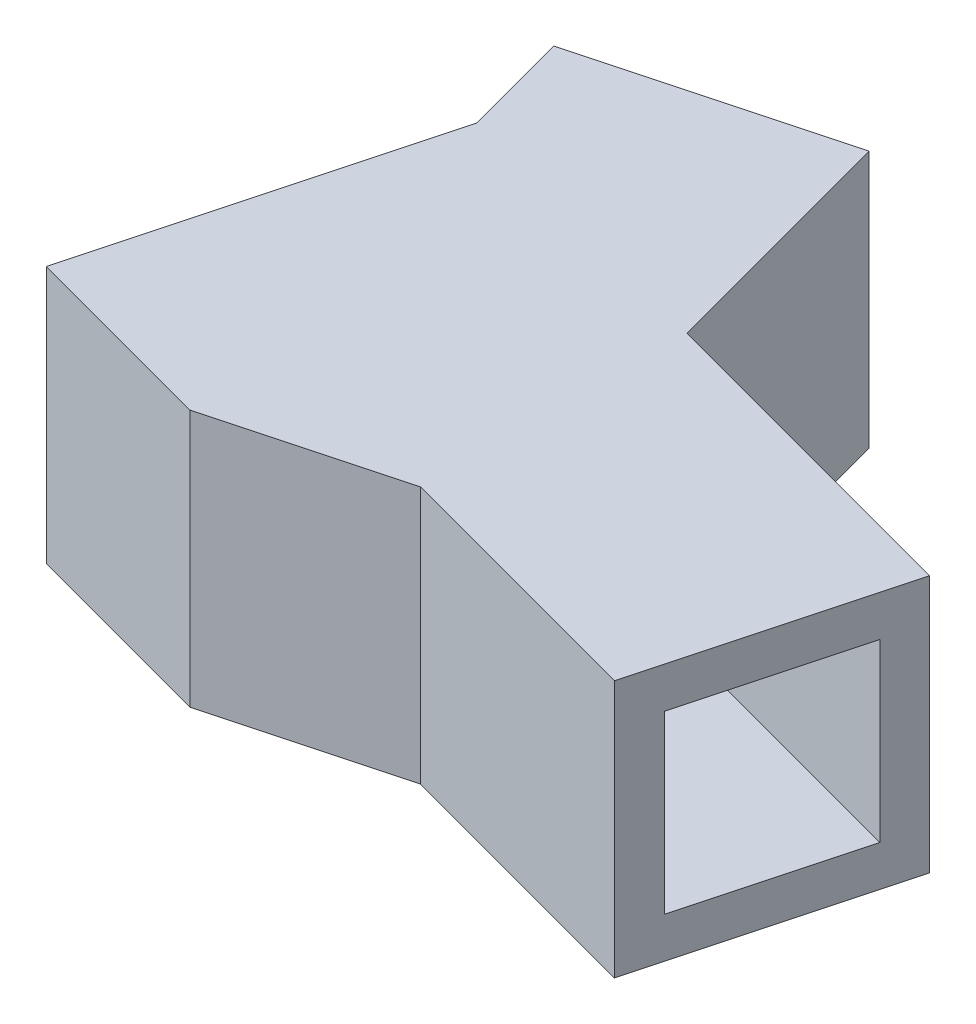
ISO-10303-21;
HEADER;
FILE_DESCRIPTION(('STEP AP214'),'2;1');
FILE_NAME('part.step','',(''),(''),'','','');
FILE_SCHEMA(('AUTOMOTIVE_DESIGN { 1 0 10303 214 1 1 1 1 }'));
ENDSEC;
DATA;
#1=APPLICATION_CONTEXT('core data for automotive mechanical design processes');
#2=APPLICATION_PROTOCOL_DEFINITION('international standard','automotive_design',2000,#1);
#3=PRODUCT_CONTEXT('',#1,'mechanical');
#4=PRODUCT('Part','Part','',(#3));
#5=PRODUCT_RELATED_PRODUCT_CATEGORY('part','',(#4));
#6=PRODUCT_DEFINITION_FORMATION('','',#4);
#7=PRODUCT_DEFINITION_CONTEXT('part definition',#1,'design');
#8=PRODUCT_DEFINITION('design','',#6,#7);
#9=PRODUCT_DEFINITION_SHAPE('','',#8);
#10=(LENGTH_UNIT() NAMED_UNIT(*) SI_UNIT(.MILLI.,.METRE.));
#11=(NAMED_UNIT(*) PLANE_ANGLE_UNIT() SI_UNIT($,.RADIAN.));
#12=(NAMED_UNIT(*) SI_UNIT($,.STERADIAN.) SOLID_ANGLE_UNIT());
#13=UNCERTAINTY_MEASURE_WITH_UNIT(LENGTH_MEASURE(1.E-05),#10,'distance_accuracy_value','');
#14=(GEOMETRIC_REPRESENTATION_CONTEXT(3) GLOBAL_UNCERTAINTY_ASSIGNED_CONTEXT((#13)) GLOBAL_UNIT_ASSIGNED_CONTEXT((#10,
#11,#12)) REPRESENTATION_CONTEXT('',''));
#15=CARTESIAN_POINT('',(0.,0.,0.));
#16=DIRECTION('',(0.,0.,1.));
#17=DIRECTION('',(1.,0.,0.));
#18=AXIS2_PLACEMENT_3D('',#15,#16,#17);
#19=CARTESIAN_POINT('',(-3.88228567653782,15.,-30.0180301004873));
#20=DIRECTION('',(0.258819045102521,0.,0.965925826289068));
#21=DIRECTION('',(0.965925826289068,0.,-0.258819045102521));
#22=AXIS2_PLACEMENT_3D('',#19,#20,#21);
#23=PLANE('',#22);
#24=DIRECTION('',(0.965925826289068,0.,-0.258819045102521));
#25=VECTOR('',#24,1.);
#26=CARTESIAN_POINT('',(-6.17635951397435,12.625,-29.4033348683688));
#27=LINE('',#26,#25);
#28=CARTESIAN_POINT('',(-16.0770992334373,12.625,-26.7504396560679));
#29=VERTEX_POINT('',#28);
#30=CARTESIAN_POINT('',(-6.17635951397435,12.625,-29.4033348683688));
#31=VERTEX_POINT('',#30);
#32=EDGE_CURVE('E301',#29,#31,#27,.T.);
#33=ORIENTED_EDGE('',*,*,#32,.F.);
#34=DIRECTION('',(0.,1.,0.));
#35=VECTOR('',#34,1.);
#36=CARTESIAN_POINT('',(-16.0770992334373,12.625,-26.7504396560679));
#37=LINE('',#36,#35);
#38=CARTESIAN_POINT('',(-16.0770992334373,2.375,-26.7504396560679));
#39=VERTEX_POINT('',#38);
#40=EDGE_CURVE('E279',#39,#29,#37,.T.);
#41=ORIENTED_EDGE('',*,*,#40,.F.);
#42=DIRECTION('',(-0.965925826289068,0.,0.258819045102521));
#43=VECTOR('',#42,1.);
#44=CARTESIAN_POINT('',(-6.17635951397436,2.375,-29.4033348683688));
#45=LINE('',#44,#43);
#46=CARTESIAN_POINT('',(-6.17635951397436,2.375,-29.4033348683688));
#47=VERTEX_POINT('',#46);
#48=EDGE_CURVE('E307',#47,#39,#45,.T.);
#49=ORIENTED_EDGE('',*,*,#48,.F.);
#50=DIRECTION('',(0.,-1.,0.));
#51=VECTOR('',#50,1.);
#52=CARTESIAN_POINT('',(-6.17635951397435,12.625,-29.4033348683688));
#53=LINE('',#52,#51);
#54=EDGE_CURVE('E304',#31,#47,#53,.T.);
#55=ORIENTED_EDGE('',*,*,#54,.F.);
#56=EDGE_LOOP('',(#33,#41,#49,#55));
#57=FACE_BOUND('',#56,.T.);
#58=DIRECTION('',(-0.965925826289068,0.,0.258819045102521));
#59=VECTOR('',#58,1.);
#60=CARTESIAN_POINT('',(-3.88228567653782,0.,-30.0180301004873));
#61=LINE('',#60,#59);
#62=CARTESIAN_POINT('',(-3.88228567653782,0.,-30.0180301004873));
#63=VERTEX_POINT('',#62);
#64=CARTESIAN_POINT('',(-18.3711730708738,0.,-26.1357444239495));
#65=VERTEX_POINT('',#64);
#66=EDGE_CURVE('E344',#63,#65,#61,.T.);
#67=ORIENTED_EDGE('',*,*,#66,.T.);
#68=DIRECTION('',(0.,-1.,0.));
#69=VECTOR('',#68,1.);
#70=CARTESIAN_POINT('',(-18.3711730708738,15.,-26.1357444239495));
#71=LINE('',#70,#69);
#72=CARTESIAN_POINT('',(-18.3711730708738,15.,-26.1357444239495));
#73=VERTEX_POINT('',#72);
#74=EDGE_CURVE('E395',#73,#65,#71,.T.);
#75=ORIENTED_EDGE('',*,*,#74,.F.);
#76=DIRECTION('',(-0.965925826289068,0.,0.258819045102521));
#77=VECTOR('',#76,1.);
#78=CARTESIAN_POINT('',(-3.88228567653782,15.,-30.0180301004873));
#79=LINE('',#78,#77);
#80=CARTESIAN_POINT('',(-3.88228567653782,15.,-30.0180301004873));
#81=VERTEX_POINT('',#80);
#82=EDGE_CURVE('E351',#81,#73,#79,.T.);
#83=ORIENTED_EDGE('',*,*,#82,.F.);
#84=DIRECTION('',(0.,-1.,0.));
#85=VECTOR('',#84,1.);
#86=CARTESIAN_POINT('',(-3.88228567653782,15.,-30.0180301004873));
#87=LINE('',#86,#85);
#88=EDGE_CURVE('E365',#81,#63,#87,.T.);
#89=ORIENTED_EDGE('',*,*,#88,.T.);
#90=EDGE_LOOP('',(#67,#75,#83,#89));
#91=FACE_BOUND('',#90,.T.);
#92=ADVANCED_FACE('F37',(#57,#91),#23,.F.);
#93=CARTESIAN_POINT('',(-18.3711730708738,15.,-26.1357444239495));
#94=DIRECTION('',(0.965925826289068,0.,-0.258819045102522));
#95=DIRECTION('',(-0.258819045102522,0.,-0.965925826289068));
#96=AXIS2_PLACEMENT_3D('',#93,#94,#95);
#97=PLANE('',#96);
#98=DIRECTION('',(0.258819045102522,0.,0.965925826289068));
#99=VECTOR('',#98,1.);
#100=CARTESIAN_POINT('',(-18.3711730708738,0.,-26.1357444239495));
#101=LINE('',#100,#99);
#102=CARTESIAN_POINT('',(-16.7303260747562,0.,-20.0120200669915));
#103=VERTEX_POINT('',#102);
#104=EDGE_CURVE('E368',#65,#103,#101,.T.);
#105=ORIENTED_EDGE('',*,*,#104,.T.);
#106=DIRECTION('',(0.,1.,0.));
#107=VECTOR('',#106,1.);
#108=CARTESIAN_POINT('',(-16.7303260747562,-25.5516051632606,-20.0120200669915));
#109=LINE('',#108,#107);
#110=CARTESIAN_POINT('',(-16.7303260747562,15.,-20.0120200669915));
#111=VERTEX_POINT('',#110);
#112=EDGE_CURVE('E242',#103,#111,#109,.T.);
#113=ORIENTED_EDGE('',*,*,#112,.T.);
#114=DIRECTION('',(0.258819045102522,0.,0.965925826289068));
#115=VECTOR('',#114,1.);
#116=CARTESIAN_POINT('',(-18.3711730708738,15.,-26.1357444239495));
#117=LINE('',#116,#115);
#118=EDGE_CURVE('E251',#73,#111,#117,.T.);
#119=ORIENTED_EDGE('',*,*,#118,.F.);
#120=ORIENTED_EDGE('',*,*,#74,.T.);
#121=EDGE_LOOP('',(#105,#113,#119,#120));
#122=FACE_BOUND('',#121,.T.);
#123=ADVANCED_FACE('F536',(#122),#97,.F.);
#124=CARTESIAN_POINT('',(-10.6066017177982,15.,2.84203036472259));
#125=DIRECTION('',(-0.258819045102521,0.,-0.965925826289068));
#126=DIRECTION('',(-0.965925826289068,0.,0.258819045102521));
#127=AXIS2_PLACEMENT_3D('',#124,#125,#126);
#128=PLANE('',#127);
#129=DIRECTION('',(0.965925826289068,0.,-0.258819045102521));
#130=VECTOR('',#129,1.);
#131=CARTESIAN_POINT('',(-10.6066017177982,0.,2.84203036472259));
#132=LINE('',#131,#130);
#133=CARTESIAN_POINT('',(-10.6066017177982,0.,2.84203036472259));
#134=VERTEX_POINT('',#133);
#135=CARTESIAN_POINT('',(0.,0.,0.));
#136=VERTEX_POINT('',#135);
#137=EDGE_CURVE('E371',#134,#136,#132,.T.);
#138=ORIENTED_EDGE('',*,*,#137,.T.);
#139=DIRECTION('',(0.,-1.,0.));
#140=VECTOR('',#139,1.);
#141=CARTESIAN_POINT('',(0.,15.,0.));
#142=LINE('',#141,#140);
#143=CARTESIAN_POINT('',(0.,15.,0.));
#144=VERTEX_POINT('',#143);
#145=EDGE_CURVE('E391',#144,#136,#142,.T.);
#146=ORIENTED_EDGE('',*,*,#145,.F.);
#147=DIRECTION('',(0.965925826289068,0.,-0.258819045102521));
#148=VECTOR('',#147,1.);
#149=CARTESIAN_POINT('',(-10.6066017177982,15.,2.84203036472259));
#150=LINE('',#149,#148);
#151=CARTESIAN_POINT('',(-10.6066017177982,15.,2.84203036472259));
#152=VERTEX_POINT('',#151);
#153=EDGE_CURVE('E355',#152,#144,#150,.T.);
#154=ORIENTED_EDGE('',*,*,#153,.F.);
#155=DIRECTION('',(0.,-1.,0.));
#156=VECTOR('',#155,1.);
#157=CARTESIAN_POINT('',(-10.6066017177982,15.,2.84203036472259));
#158=LINE('',#157,#156);
#159=EDGE_CURVE('E255',#152,#134,#158,.T.);
#160=ORIENTED_EDGE('',*,*,#159,.T.);
#161=EDGE_LOOP('',(#138,#146,#154,#160));
#162=FACE_BOUND('',#161,.T.);
#163=ADVANCED_FACE('F543',(#162),#128,.F.);
#164=CARTESIAN_POINT('',(0.,15.,0.));
#165=DIRECTION('',(0.258819045102521,0.,-0.965925826289068));
#166=DIRECTION('',(-0.965925826289068,0.,-0.258819045102521));
#167=AXIS2_PLACEMENT_3D('',#164,#165,#166);
#168=PLANE('',#167);
#169=DIRECTION('',(0.965925826289068,0.,0.258819045102521));
#170=VECTOR('',#169,1.);
#171=CARTESIAN_POINT('',(0.,0.,0.));
#172=LINE('',#171,#170);
#173=CARTESIAN_POINT('',(15.4362308492435,0.,4.1361255902352));
#174=VERTEX_POINT('',#173);
#175=EDGE_CURVE('E373',#136,#174,#172,.T.);
#176=ORIENTED_EDGE('',*,*,#175,.T.);
#177=DIRECTION('',(0.,-1.,0.));
#178=VECTOR('',#177,1.);
#179=CARTESIAN_POINT('',(15.4362308492435,15.,4.1361255902352));
#180=LINE('',#179,#178);
#181=CARTESIAN_POINT('',(15.4362308492435,15.,4.1361255902352));
#182=VERTEX_POINT('',#181);
#183=EDGE_CURVE('E388',#182,#174,#180,.T.);
#184=ORIENTED_EDGE('',*,*,#183,.F.);
#185=DIRECTION('',(0.965925826289068,0.,0.258819045102521));
#186=VECTOR('',#185,1.);
#187=CARTESIAN_POINT('',(0.,15.,0.));
#188=LINE('',#187,#186);
#189=EDGE_CURVE('E357',#144,#182,#188,.T.);
#190=ORIENTED_EDGE('',*,*,#189,.F.);
#191=ORIENTED_EDGE('',*,*,#145,.T.);
#192=EDGE_LOOP('',(#176,#184,#190,#191));
#193=FACE_BOUND('',#192,.T.);
#194=ADVANCED_FACE('F612',(#193),#168,.F.);
#195=CARTESIAN_POINT('',(15.4362308492435,15.,4.1361255902352));
#196=DIRECTION('',(-0.965925826289068,0.,-0.258819045102521));
#197=DIRECTION('',(-0.258819045102521,0.,0.965925826289068));
#198=AXIS2_PLACEMENT_3D('',#195,#196,#197);
#199=PLANE('',#198);
#200=DIRECTION('',(-0.258819045102522,0.,0.965925826289068));
#201=VECTOR('',#200,1.);
#202=CARTESIAN_POINT('',(16.050926081362,12.625,1.84205175279867));
#203=LINE('',#202,#201);
#204=CARTESIAN_POINT('',(18.7038212936629,12.625,-8.05868796666426));
#205=VERTEX_POINT('',#204);
#206=CARTESIAN_POINT('',(16.050926081362,12.625,1.84205175279867));
#207=VERTEX_POINT('',#206);
#208=EDGE_CURVE('E334',#205,#207,#203,.T.);
#209=ORIENTED_EDGE('',*,*,#208,.F.);
#210=DIRECTION('',(0.,1.,0.));
#211=VECTOR('',#210,1.);
#212=CARTESIAN_POINT('',(18.7038212936629,2.375,-8.05868796666428));
#213=LINE('',#212,#211);
#214=CARTESIAN_POINT('',(18.7038212936629,2.375,-8.05868796666428));
#215=VERTEX_POINT('',#214);
#216=EDGE_CURVE('E312',#215,#205,#213,.T.);
#217=ORIENTED_EDGE('',*,*,#216,.F.);
#218=DIRECTION('',(0.258819045102522,0.,-0.965925826289068));
#219=VECTOR('',#218,1.);
#220=CARTESIAN_POINT('',(16.050926081362,2.375,1.84205175279867));
#221=LINE('',#220,#219);
#222=CARTESIAN_POINT('',(16.050926081362,2.375,1.84205175279867));
#223=VERTEX_POINT('',#222);
#224=EDGE_CURVE('E323',#223,#215,#221,.T.);
#225=ORIENTED_EDGE('',*,*,#224,.F.);
#226=DIRECTION('',(0.,-1.,0.));
#227=VECTOR('',#226,1.);
#228=CARTESIAN_POINT('',(16.050926081362,2.375,1.84205175279867));
#229=LINE('',#228,#227);
#230=EDGE_CURVE('E337',#207,#223,#229,.T.);
#231=ORIENTED_EDGE('',*,*,#230,.F.);
#232=EDGE_LOOP('',(#209,#217,#225,#231));
#233=FACE_BOUND('',#232,.T.);
#234=DIRECTION('',(0.258819045102521,0.,-0.965925826289068));
#235=VECTOR('',#234,1.);
#236=CARTESIAN_POINT('',(15.4362308492435,0.,4.1361255902352));
#237=LINE('',#236,#235);
#238=CARTESIAN_POINT('',(19.3185165257814,0.,-10.3527618041008));
#239=VERTEX_POINT('',#238);
#240=EDGE_CURVE('E375',#174,#239,#237,.T.);
#241=ORIENTED_EDGE('',*,*,#240,.T.);
#242=DIRECTION('',(0.,-1.,0.));
#243=VECTOR('',#242,1.);
#244=CARTESIAN_POINT('',(19.3185165257814,15.,-10.3527618041008));
#245=LINE('',#244,#243);
#246=CARTESIAN_POINT('',(19.3185165257814,15.,-10.3527618041008));
#247=VERTEX_POINT('',#246);
#248=EDGE_CURVE('E385',#247,#239,#245,.T.);
#249=ORIENTED_EDGE('',*,*,#248,.F.);
#250=DIRECTION('',(0.258819045102521,0.,-0.965925826289068));
#251=VECTOR('',#250,1.);
#252=CARTESIAN_POINT('',(15.4362308492435,15.,4.1361255902352));
#253=LINE('',#252,#251);
#254=EDGE_CURVE('E359',#182,#247,#253,.T.);
#255=ORIENTED_EDGE('',*,*,#254,.F.);
#256=ORIENTED_EDGE('',*,*,#183,.T.);
#257=EDGE_LOOP('',(#241,#249,#255,#256));
#258=FACE_BOUND('',#257,.T.);
#259=ADVANCED_FACE('F807',(#233,#258),#199,.F.);
#260=CARTESIAN_POINT('',(19.3185165257814,15.,-10.3527618041008));
#261=DIRECTION('',(-0.258819045102521,0.,0.965925826289068));
#262=DIRECTION('',(0.965925826289068,0.,0.258819045102521));
#263=AXIS2_PLACEMENT_3D('',#260,#261,#262);
#264=PLANE('',#263);
#265=DIRECTION('',(-0.965925826289068,0.,-0.258819045102522));
#266=VECTOR('',#265,1.);
#267=CARTESIAN_POINT('',(19.3185165257814,0.,-10.3527618041008));
#268=LINE('',#267,#266);
#269=CARTESIAN_POINT('',(0.,0.,-15.5291427061513));
#270=VERTEX_POINT('',#269);
#271=EDGE_CURVE('E377',#239,#270,#268,.T.);
#272=ORIENTED_EDGE('',*,*,#271,.T.);
#273=DIRECTION('',(0.,-1.,0.));
#274=VECTOR('',#273,1.);
#275=CARTESIAN_POINT('',(0.,15.,-15.5291427061513));
#276=LINE('',#275,#274);
#277=CARTESIAN_POINT('',(0.,15.,-15.5291427061513));
#278=VERTEX_POINT('',#277);
#279=EDGE_CURVE('E382',#278,#270,#276,.T.);
#280=ORIENTED_EDGE('',*,*,#279,.F.);
#281=DIRECTION('',(-0.965925826289068,0.,-0.258819045102522));
#282=VECTOR('',#281,1.);
#283=CARTESIAN_POINT('',(19.3185165257814,15.,-10.3527618041008));
#284=LINE('',#283,#282);
#285=EDGE_CURVE('E361',#247,#278,#284,.T.);
#286=ORIENTED_EDGE('',*,*,#285,.F.);
#287=ORIENTED_EDGE('',*,*,#248,.T.);
#288=EDGE_LOOP('',(#272,#280,#286,#287));
#289=FACE_BOUND('',#288,.T.);
#290=ADVANCED_FACE('F812',(#289),#264,.F.);
#291=CARTESIAN_POINT('',(0.,15.,-15.5291427061513));
#292=DIRECTION('',(-0.965925826289068,0.,0.258819045102521));
#293=DIRECTION('',(0.258819045102521,0.,0.965925826289068));
#294=AXIS2_PLACEMENT_3D('',#291,#292,#293);
#295=PLANE('',#294);
#296=DIRECTION('',(-0.258819045102521,0.,-0.965925826289068));
#297=VECTOR('',#296,1.);
#298=CARTESIAN_POINT('',(0.,0.,-15.5291427061513));
#299=LINE('',#298,#297);
#300=EDGE_CURVE('E353',#270,#63,#299,.T.);
#301=ORIENTED_EDGE('',*,*,#300,.T.);
#302=ORIENTED_EDGE('',*,*,#88,.F.);
#303=DIRECTION('',(-0.258819045102521,0.,-0.965925826289068));
#304=VECTOR('',#303,1.);
#305=CARTESIAN_POINT('',(0.,15.,-15.5291427061513));
#306=LINE('',#305,#304);
#307=EDGE_CURVE('E363',#278,#81,#306,.T.);
#308=ORIENTED_EDGE('',*,*,#307,.F.);
#309=ORIENTED_EDGE('',*,*,#279,.T.);
#310=EDGE_LOOP('',(#301,#302,#308,#309));
#311=FACE_BOUND('',#310,.T.);
#312=ADVANCED_FACE('F603',(#311),#295,.F.);
#313=CARTESIAN_POINT('',(0.,15.,0.));
#314=DIRECTION('',(0.,1.,0.));
#315=DIRECTION('',(0.,0.,1.));
#316=AXIS2_PLACEMENT_3D('',#313,#314,#315);
#317=PLANE('',#316);
#318=ORIENTED_EDGE('',*,*,#82,.T.);
#319=ORIENTED_EDGE('',*,*,#118,.T.);
#320=DIRECTION('',(-0.258819045102521,0.,0.965925826289068));
#321=VECTOR('',#320,1.);
#322=CARTESIAN_POINT('',(-22.0336269336553,15.,-0.219831813756402));
#323=LINE('',#322,#321);
#324=CARTESIAN_POINT('',(-22.0336269336553,15.,-0.219831813756402));
#325=VERTEX_POINT('',#324);
#326=EDGE_CURVE('E54',#111,#325,#323,.T.);
#327=ORIENTED_EDGE('',*,*,#326,.T.);
#328=DIRECTION('',(0.965925826289068,0.,0.258819045102521));
#329=VECTOR('',#328,1.);
#330=CARTESIAN_POINT('',(-10.6066017177982,15.,2.84203036472259));
#331=LINE('',#330,#329);
#332=EDGE_CURVE('E249',#325,#152,#331,.T.);
#333=ORIENTED_EDGE('',*,*,#332,.T.);
#334=ORIENTED_EDGE('',*,*,#153,.T.);
#335=ORIENTED_EDGE('',*,*,#189,.T.);
#336=ORIENTED_EDGE('',*,*,#254,.T.);
#337=ORIENTED_EDGE('',*,*,#285,.T.);
#338=ORIENTED_EDGE('',*,*,#307,.T.);
#339=EDGE_LOOP('',(#318,#319,#327,#333,#334,#335,#336,#337,#338));
#340=FACE_BOUND('',#339,.T.);
#341=ADVANCED_FACE('F248',(#340),#317,.T.);
#342=CARTESIAN_POINT('',(0.,0.,0.));
#343=DIRECTION('',(0.,1.,0.));
#344=DIRECTION('',(0.,0.,1.));
#345=AXIS2_PLACEMENT_3D('',#342,#343,#344);
#346=PLANE('',#345);
#347=ORIENTED_EDGE('',*,*,#66,.F.);
#348=ORIENTED_EDGE('',*,*,#300,.F.);
#349=ORIENTED_EDGE('',*,*,#271,.F.);
#350=ORIENTED_EDGE('',*,*,#240,.F.);
#351=ORIENTED_EDGE('',*,*,#175,.F.);
#352=ORIENTED_EDGE('',*,*,#137,.F.);
#353=DIRECTION('',(-0.965925826289068,0.,-0.258819045102521));
#354=VECTOR('',#353,1.);
#355=CARTESIAN_POINT('',(-10.6066017177982,0.,2.84203036472259));
#356=LINE('',#355,#354);
#357=CARTESIAN_POINT('',(-22.0336269336553,0.,-0.219831813756402));
#358=VERTEX_POINT('',#357);
#359=EDGE_CURVE('E241',#134,#358,#356,.T.);
#360=ORIENTED_EDGE('',*,*,#359,.T.);
#361=DIRECTION('',(0.258819045102522,0.,-0.965925826289068));
#362=VECTOR('',#361,1.);
#363=CARTESIAN_POINT('',(-22.0336269336553,0.,-0.219831813756402));
#364=LINE('',#363,#362);
#365=EDGE_CURVE('E238',#358,#103,#364,.T.);
#366=ORIENTED_EDGE('',*,*,#365,.T.);
#367=ORIENTED_EDGE('',*,*,#104,.F.);
#368=EDGE_LOOP('',(#347,#348,#349,#350,#351,#352,#360,#366,#367));
#369=FACE_BOUND('',#368,.T.);
#370=ADVANCED_FACE('F590',(#369),#346,.F.);
#371=CARTESIAN_POINT('',(1.31715642045964,2.375,-12.7174307785097));
#372=DIRECTION('',(0.258819045102521,0.,-0.965925826289068));
#373=DIRECTION('',(-0.965925826289068,0.,-0.258819045102521));
#374=AXIS2_PLACEMENT_3D('',#371,#372,#373);
#375=PLANE('',#374);
#376=ORIENTED_EDGE('',*,*,#216,.T.);
#377=DIRECTION('',(0.965925826289068,0.,0.258819045102521));
#378=VECTOR('',#377,1.);
#379=CARTESIAN_POINT('',(1.31715642045964,12.625,-12.7174307785097));
#380=LINE('',#379,#378);
#381=CARTESIAN_POINT('',(1.31715642045964,12.625,-12.7174307785097));
#382=VERTEX_POINT('',#381);
#383=EDGE_CURVE('E332',#382,#205,#380,.T.);
#384=ORIENTED_EDGE('',*,*,#383,.F.);
#385=DIRECTION('',(0.,1.,0.));
#386=VECTOR('',#385,1.);
#387=CARTESIAN_POINT('',(1.31715642045964,2.375,-12.7174307785097));
#388=LINE('',#387,#386);
#389=CARTESIAN_POINT('',(1.31715642045964,2.375,-12.7174307785097));
#390=VERTEX_POINT('',#389);
#391=EDGE_CURVE('E319',#390,#382,#388,.T.);
#392=ORIENTED_EDGE('',*,*,#391,.F.);
#393=DIRECTION('',(0.965925826289068,0.,0.258819045102521));
#394=VECTOR('',#393,1.);
#395=CARTESIAN_POINT('',(1.31715642045964,2.375,-12.7174307785097));
#396=LINE('',#395,#394);
#397=EDGE_CURVE('E342',#390,#215,#396,.T.);
#398=ORIENTED_EDGE('',*,*,#397,.T.);
#399=EDGE_LOOP('',(#376,#384,#392,#398));
#400=FACE_BOUND('',#399,.T.);
#401=ADVANCED_FACE('F593',(#400),#375,.F.);
#402=CARTESIAN_POINT('',(-1.3357387918412,2.375,-2.81669105904672));
#403=DIRECTION('',(0.,-1.,0.));
#404=DIRECTION('',(0.,0.,-1.));
#405=AXIS2_PLACEMENT_3D('',#402,#403,#404);
#406=PLANE('',#405);
#407=ORIENTED_EDGE('',*,*,#224,.T.);
#408=ORIENTED_EDGE('',*,*,#397,.F.);
#409=DIRECTION('',(0.258819045102522,0.,-0.965925826289068));
#410=VECTOR('',#409,1.);
#411=CARTESIAN_POINT('',(-1.3357387918412,2.375,-2.81669105904672));
#412=LINE('',#411,#410);
#413=CARTESIAN_POINT('',(-1.3357387918412,2.375,-2.81669105904672));
#414=VERTEX_POINT('',#413);
#415=EDGE_CURVE('E329',#414,#390,#412,.T.);
#416=ORIENTED_EDGE('',*,*,#415,.F.);
#417=DIRECTION('',(0.965925826289068,0.,0.258819045102521));
#418=VECTOR('',#417,1.);
#419=CARTESIAN_POINT('',(-1.3357387918412,2.375,-2.81669105904672));
#420=LINE('',#419,#418);
#421=EDGE_CURVE('E345',#414,#223,#420,.T.);
#422=ORIENTED_EDGE('',*,*,#421,.T.);
#423=EDGE_LOOP('',(#407,#408,#416,#422));
#424=FACE_BOUND('',#423,.T.);
#425=ADVANCED_FACE('F782',(#424),#406,.F.);
#426=CARTESIAN_POINT('',(-1.3357387918412,2.375,-2.81669105904672));
#427=DIRECTION('',(-0.258819045102521,0.,0.965925826289068));
#428=DIRECTION('',(0.965925826289068,0.,0.258819045102521));
#429=AXIS2_PLACEMENT_3D('',#426,#427,#428);
#430=PLANE('',#429);
#431=ORIENTED_EDGE('',*,*,#230,.T.);
#432=ORIENTED_EDGE('',*,*,#421,.F.);
#433=DIRECTION('',(0.,-1.,0.));
#434=VECTOR('',#433,1.);
#435=CARTESIAN_POINT('',(-1.3357387918412,2.375,-2.81669105904672));
#436=LINE('',#435,#434);
#437=CARTESIAN_POINT('',(-1.3357387918412,12.625,-2.81669105904672));
#438=VERTEX_POINT('',#437);
#439=EDGE_CURVE('E326',#438,#414,#436,.T.);
#440=ORIENTED_EDGE('',*,*,#439,.F.);
#441=DIRECTION('',(0.965925826289068,0.,0.258819045102521));
#442=VECTOR('',#441,1.);
#443=CARTESIAN_POINT('',(-1.3357387918412,12.625,-2.81669105904672));
#444=LINE('',#443,#442);
#445=EDGE_CURVE('E347',#438,#207,#444,.T.);
#446=ORIENTED_EDGE('',*,*,#445,.T.);
#447=EDGE_LOOP('',(#431,#432,#440,#446));
#448=FACE_BOUND('',#447,.T.);
#449=ADVANCED_FACE('F772',(#448),#430,.F.);
#450=CARTESIAN_POINT('',(-1.3357387918412,12.625,-2.81669105904672));
#451=DIRECTION('',(0.,1.,0.));
#452=DIRECTION('',(0.,0.,1.));
#453=AXIS2_PLACEMENT_3D('',#450,#451,#452);
#454=PLANE('',#453);
#455=ORIENTED_EDGE('',*,*,#208,.T.);
#456=ORIENTED_EDGE('',*,*,#445,.F.);
#457=DIRECTION('',(-0.258819045102522,0.,0.965925826289068));
#458=VECTOR('',#457,1.);
#459=CARTESIAN_POINT('',(-1.3357387918412,12.625,-2.81669105904672));
#460=LINE('',#459,#458);
#461=EDGE_CURVE('E322',#382,#438,#460,.T.);
#462=ORIENTED_EDGE('',*,*,#461,.F.);
#463=ORIENTED_EDGE('',*,*,#383,.T.);
#464=EDGE_LOOP('',(#455,#456,#462,#463));
#465=FACE_BOUND('',#464,.T.);
#466=ADVANCED_FACE('F734',(#465),#454,.F.);
#467=CARTESIAN_POINT('',(-1.95043402395969,0.,-0.522617221610182));
#468=DIRECTION('',(-0.965925826289068,0.,-0.258819045102522));
#469=DIRECTION('',(-0.258819045102522,0.,0.965925826289068));
#470=AXIS2_PLACEMENT_3D('',#467,#468,#469);
#471=PLANE('',#470);
#472=DIRECTION('',(0.,1.,0.));
#473=VECTOR('',#472,1.);
#474=CARTESIAN_POINT('',(1.02598499471931,3.5,-11.6307642239345));
#475=LINE('',#474,#473);
#476=CARTESIAN_POINT('',(1.02598499471931,6.5,-11.6307642239345));
#477=VERTEX_POINT('',#476);
#478=CARTESIAN_POINT('',(1.02598499471931,8.49999999999999,-11.6307642239345));
#479=VERTEX_POINT('',#478);
#480=EDGE_CURVE('E280',#477,#479,#475,.T.);
#481=ORIENTED_EDGE('',*,*,#480,.F.);
#482=CARTESIAN_POINT('',(0.249527859411743,6.5,-8.73298674506726));
#483=DIRECTION('',(-0.965925826289068,0.,-0.258819045102522));
#484=DIRECTION('',(-0.258819045102522,0.,0.965925826289068));
#485=AXIS2_PLACEMENT_3D('',#482,#483,#484);
#486=CIRCLE('',#485,3.);
#487=CARTESIAN_POINT('',(0.249527859411743,3.5,-8.73298674506725));
#488=VERTEX_POINT('',#487);
#489=EDGE_CURVE('E457',#477,#488,#486,.T.);
#490=ORIENTED_EDGE('',*,*,#489,.T.);
#491=DIRECTION('',(0.258819045102522,0.,-0.965925826289068));
#492=VECTOR('',#491,1.);
#493=CARTESIAN_POINT('',(1.02598499471931,3.5,-11.6307642239345));
#494=LINE('',#493,#492);
#495=CARTESIAN_POINT('',(-0.2681102307933,3.5,-6.80113509248912));
#496=VERTEX_POINT('',#495);
#497=EDGE_CURVE('E282',#496,#488,#494,.T.);
#498=ORIENTED_EDGE('',*,*,#497,.F.);
#499=CARTESIAN_POINT('',(-0.268110230793296,6.5,-6.80113509248912));
#500=DIRECTION('',(-0.965925826289068,0.,-0.258819045102522));
#501=DIRECTION('',(-0.258819045102522,0.,0.965925826289068));
#502=AXIS2_PLACEMENT_3D('',#499,#500,#501);
#503=CIRCLE('',#502,3.);
#504=CARTESIAN_POINT('',(-1.04456736610086,6.5,-3.90335761362192));
#505=VERTEX_POINT('',#504);
#506=EDGE_CURVE('E11',#496,#505,#503,.T.);
#507=ORIENTED_EDGE('',*,*,#506,.T.);
#508=DIRECTION('',(0.,-1.,0.));
#509=VECTOR('',#508,1.);
#510=CARTESIAN_POINT('',(-1.04456736610086,3.5,-3.90335761362192));
#511=LINE('',#510,#509);
#512=CARTESIAN_POINT('',(-1.04456736610086,8.49999999999999,-3.90335761362192));
#513=VERTEX_POINT('',#512);
#514=EDGE_CURVE('E275',#513,#505,#511,.T.);
#515=ORIENTED_EDGE('',*,*,#514,.F.);
#516=CARTESIAN_POINT('',(-0.268110230793296,8.49999999999999,-6.80113509248912));
#517=DIRECTION('',(-0.965925826289068,0.,-0.258819045102522));
#518=DIRECTION('',(-0.258819045102522,0.,0.965925826289068));
#519=AXIS2_PLACEMENT_3D('',#516,#517,#518);
#520=CIRCLE('',#519,3.);
#521=CARTESIAN_POINT('',(-0.2681102307933,11.5,-6.80113509248912));
#522=VERTEX_POINT('',#521);
#523=EDGE_CURVE('E451',#513,#522,#520,.T.);
#524=ORIENTED_EDGE('',*,*,#523,.T.);
#525=DIRECTION('',(-0.258819045102522,0.,0.965925826289068));
#526=VECTOR('',#525,1.);
#527=CARTESIAN_POINT('',(1.02598499471931,11.5,-11.6307642239345));
#528=LINE('',#527,#526);
#529=CARTESIAN_POINT('',(0.249527859411743,11.5,-8.73298674506725));
#530=VERTEX_POINT('',#529);
#531=EDGE_CURVE('E276',#530,#522,#528,.T.);
#532=ORIENTED_EDGE('',*,*,#531,.F.);
#533=CARTESIAN_POINT('',(0.249527859411743,8.49999999999999,-8.73298674506726));
#534=DIRECTION('',(-0.965925826289068,0.,-0.258819045102522));
#535=DIRECTION('',(-0.258819045102522,0.,0.965925826289068));
#536=AXIS2_PLACEMENT_3D('',#533,#534,#535);
#537=CIRCLE('',#536,3.);
#538=EDGE_CURVE('E62',#530,#479,#537,.T.);
#539=ORIENTED_EDGE('',*,*,#538,.T.);
#540=EDGE_LOOP('',(#481,#490,#498,#507,#515,#524,#532,#539));
#541=FACE_BOUND('',#540,.T.);
#542=ORIENTED_EDGE('',*,*,#391,.T.);
#543=ORIENTED_EDGE('',*,*,#461,.T.);
#544=ORIENTED_EDGE('',*,*,#439,.T.);
#545=ORIENTED_EDGE('',*,*,#415,.T.);
#546=EDGE_LOOP('',(#542,#543,#544,#545));
#547=FACE_BOUND('',#546,.T.);
#548=ADVANCED_FACE('F483',(#541,#547),#471,.F.);
#549=CARTESIAN_POINT('',(-11.6771754666944,12.625,-10.3297006091538));
#550=DIRECTION('',(-0.965925826289068,0.,0.258819045102521));
#551=DIRECTION('',(0.258819045102521,0.,0.965925826289068));
#552=AXIS2_PLACEMENT_3D('',#549,#550,#551);
#553=PLANE('',#552);
#554=DIRECTION('',(0.,1.,0.));
#555=VECTOR('',#554,1.);
#556=CARTESIAN_POINT('',(-11.6771754666944,12.625,-10.3297006091538));
#557=LINE('',#556,#555);
#558=CARTESIAN_POINT('',(-11.6771754666944,8.49999999999999,-10.3297006091538));
#559=VERTEX_POINT('',#558);
#560=CARTESIAN_POINT('',(-11.6771754666944,12.625,-10.3297006091538));
#561=VERTEX_POINT('',#560);
#562=EDGE_CURVE('E290',#559,#561,#557,.T.);
#563=ORIENTED_EDGE('',*,*,#562,.F.);
#564=DIRECTION('',(0.258819045102521,0.,0.965925826289068));
#565=VECTOR('',#564,1.);
#566=CARTESIAN_POINT('',(-11.5410606084436,8.49999999999999,-9.82171304249665));
#567=LINE('',#566,#565);
#568=CARTESIAN_POINT('',(-11.5410606084436,8.49999999999999,-9.82171304249665));
#569=VERTEX_POINT('',#568);
#570=EDGE_CURVE('E412',#559,#569,#567,.T.);
#571=ORIENTED_EDGE('',*,*,#570,.T.);
#572=DIRECTION('',(0.,-1.,0.));
#573=VECTOR('',#572,1.);
#574=CARTESIAN_POINT('',(-11.5410606084436,3.5,-9.82171304249665));
#575=LINE('',#574,#573);
#576=CARTESIAN_POINT('',(-11.5410606084436,6.5,-9.82171304249665));
#577=VERTEX_POINT('',#576);
#578=EDGE_CURVE('E403',#569,#577,#575,.T.);
#579=ORIENTED_EDGE('',*,*,#578,.T.);
#580=DIRECTION('',(-0.258819045102521,0.,-0.965925826289068));
#581=VECTOR('',#580,1.);
#582=CARTESIAN_POINT('',(-11.6771754666944,6.5,-10.3297006091538));
#583=LINE('',#582,#581);
#584=CARTESIAN_POINT('',(-11.6771754666944,6.5,-10.3297006091538));
#585=VERTEX_POINT('',#584);
#586=EDGE_CURVE('E409',#577,#585,#583,.T.);
#587=ORIENTED_EDGE('',*,*,#586,.T.);
#588=CARTESIAN_POINT('',(-11.6771754666944,2.375,-10.3297006091538));
#589=VERTEX_POINT('',#588);
#590=EDGE_CURVE('E287',#589,#585,#557,.T.);
#591=ORIENTED_EDGE('',*,*,#590,.F.);
#592=DIRECTION('',(-0.258819045102521,0.,-0.965925826289068));
#593=VECTOR('',#592,1.);
#594=CARTESIAN_POINT('',(-11.6771754666944,2.375,-10.3297006091538));
#595=LINE('',#594,#593);
#596=EDGE_CURVE('E310',#589,#39,#595,.T.);
#597=ORIENTED_EDGE('',*,*,#596,.T.);
#598=ORIENTED_EDGE('',*,*,#40,.T.);
#599=DIRECTION('',(-0.258819045102521,0.,-0.965925826289068));
#600=VECTOR('',#599,1.);
#601=CARTESIAN_POINT('',(-11.6771754666944,12.625,-10.3297006091538));
#602=LINE('',#601,#600);
#603=EDGE_CURVE('E299',#561,#29,#602,.T.);
#604=ORIENTED_EDGE('',*,*,#603,.F.);
#605=EDGE_LOOP('',(#563,#571,#579,#587,#591,#597,#598,#604));
#606=FACE_BOUND('',#605,.T.);
#607=ADVANCED_FACE('F522',(#606),#553,.F.);
#608=CARTESIAN_POINT('',(-1.7764357472315,2.375,-12.9825958214546));
#609=DIRECTION('',(0.,-1.,0.));
#610=DIRECTION('',(0.,0.,-1.));
#611=AXIS2_PLACEMENT_3D('',#608,#609,#610);
#612=PLANE('',#611);
#613=ORIENTED_EDGE('',*,*,#48,.T.);
#614=ORIENTED_EDGE('',*,*,#596,.F.);
#615=DIRECTION('',(-0.965925826289068,0.,0.258819045102521));
#616=VECTOR('',#615,1.);
#617=CARTESIAN_POINT('',(-1.7764357472315,2.375,-12.9825958214546));
#618=LINE('',#617,#616);
#619=CARTESIAN_POINT('',(-1.7764357472315,2.375,-12.9825958214546));
#620=VERTEX_POINT('',#619);
#621=EDGE_CURVE('E296',#620,#589,#618,.T.);
#622=ORIENTED_EDGE('',*,*,#621,.F.);
#623=DIRECTION('',(-0.258819045102521,0.,-0.965925826289068));
#624=VECTOR('',#623,1.);
#625=CARTESIAN_POINT('',(-1.7764357472315,2.375,-12.9825958214546));
#626=LINE('',#625,#624);
#627=EDGE_CURVE('E313',#620,#47,#626,.T.);
#628=ORIENTED_EDGE('',*,*,#627,.T.);
#629=EDGE_LOOP('',(#613,#614,#622,#628));
#630=FACE_BOUND('',#629,.T.);
#631=ADVANCED_FACE('F723',(#630),#612,.F.);
#632=CARTESIAN_POINT('',(-1.77643574723149,12.625,-12.9825958214546));
#633=DIRECTION('',(0.965925826289068,0.,-0.258819045102521));
#634=DIRECTION('',(-0.258819045102521,0.,-0.965925826289068));
#635=AXIS2_PLACEMENT_3D('',#632,#633,#634);
#636=PLANE('',#635);
#637=ORIENTED_EDGE('',*,*,#54,.T.);
#638=ORIENTED_EDGE('',*,*,#627,.F.);
#639=DIRECTION('',(0.,-1.,0.));
#640=VECTOR('',#639,1.);
#641=CARTESIAN_POINT('',(-1.77643574723149,12.625,-12.9825958214546));
#642=LINE('',#641,#640);
#643=CARTESIAN_POINT('',(-1.77643574723149,12.625,-12.9825958214546));
#644=VERTEX_POINT('',#643);
#645=EDGE_CURVE('E293',#644,#620,#642,.T.);
#646=ORIENTED_EDGE('',*,*,#645,.F.);
#647=DIRECTION('',(-0.258819045102521,0.,-0.965925826289068));
#648=VECTOR('',#647,1.);
#649=CARTESIAN_POINT('',(-1.77643574723149,12.625,-12.9825958214546));
#650=LINE('',#649,#648);
#651=EDGE_CURVE('E315',#644,#31,#650,.T.);
#652=ORIENTED_EDGE('',*,*,#651,.T.);
#653=EDGE_LOOP('',(#637,#638,#646,#652));
#654=FACE_BOUND('',#653,.T.);
#655=ADVANCED_FACE('F743',(#654),#636,.F.);
#656=CARTESIAN_POINT('',(-1.77643574723149,12.625,-12.9825958214546));
#657=DIRECTION('',(0.,1.,0.));
#658=DIRECTION('',(0.,0.,1.));
#659=AXIS2_PLACEMENT_3D('',#656,#657,#658);
#660=PLANE('',#659);
#661=ORIENTED_EDGE('',*,*,#32,.T.);
#662=ORIENTED_EDGE('',*,*,#651,.F.);
#663=DIRECTION('',(0.965925826289068,0.,-0.258819045102521));
#664=VECTOR('',#663,1.);
#665=CARTESIAN_POINT('',(-1.77643574723149,12.625,-12.9825958214546));
#666=LINE('',#665,#664);
#667=EDGE_CURVE('E289',#561,#644,#666,.T.);
#668=ORIENTED_EDGE('',*,*,#667,.F.);
#669=ORIENTED_EDGE('',*,*,#603,.T.);
#670=EDGE_LOOP('',(#661,#662,#668,#669));
#671=FACE_BOUND('',#670,.T.);
#672=ADVANCED_FACE('F711',(#671),#660,.F.);
#673=CARTESIAN_POINT('',(-3.36464758633278,0.,-12.5570357417579));
#674=DIRECTION('',(-0.258819045102521,0.,-0.965925826289068));
#675=DIRECTION('',(-0.965925826289068,0.,0.258819045102521));
#676=AXIS2_PLACEMENT_3D('',#673,#674,#675);
#677=PLANE('',#676);
#678=DIRECTION('',(0.,-1.,0.));
#679=VECTOR('',#678,1.);
#680=CARTESIAN_POINT('',(-2.8631023018067,3.5,-12.6914243957143));
#681=LINE('',#680,#679);
#682=CARTESIAN_POINT('',(-2.8631023018067,11.5,-12.6914243957143));
#683=VERTEX_POINT('',#682);
#684=CARTESIAN_POINT('',(-2.8631023018067,3.5,-12.6914243957143));
#685=VERTEX_POINT('',#684);
#686=EDGE_CURVE('E262',#683,#685,#681,.T.);
#687=ORIENTED_EDGE('',*,*,#686,.F.);
#688=DIRECTION('',(0.965925826289068,0.,-0.258819045102521));
#689=VECTOR('',#688,1.);
#690=CARTESIAN_POINT('',(-3.36464758633278,11.5,-12.5570357417579));
#691=LINE('',#690,#689);
#692=CARTESIAN_POINT('',(-8.77939798782724,11.5,-11.1061577444614));
#693=VERTEX_POINT('',#692);
#694=EDGE_CURVE('E398',#693,#683,#691,.T.);
#695=ORIENTED_EDGE('',*,*,#694,.F.);
#696=CARTESIAN_POINT('',(-8.77939798782724,8.49999999999999,-11.1061577444614));
#697=DIRECTION('',(-0.258819045102521,0.,-0.965925826289068));
#698=DIRECTION('',(-0.965925826289068,0.,0.258819045102521));
#699=AXIS2_PLACEMENT_3D('',#696,#697,#698);
#700=CIRCLE('',#699,3.);
#701=EDGE_CURVE('E446',#693,#559,#700,.F.);
#702=ORIENTED_EDGE('',*,*,#701,.T.);
#703=ORIENTED_EDGE('',*,*,#562,.T.);
#704=ORIENTED_EDGE('',*,*,#667,.T.);
#705=ORIENTED_EDGE('',*,*,#645,.T.);
#706=ORIENTED_EDGE('',*,*,#621,.T.);
#707=ORIENTED_EDGE('',*,*,#590,.T.);
#708=CARTESIAN_POINT('',(-8.77939798782724,6.5,-11.1061577444614));
#709=DIRECTION('',(-0.258819045102521,0.,-0.965925826289068));
#710=DIRECTION('',(-0.965925826289068,0.,0.258819045102521));
#711=AXIS2_PLACEMENT_3D('',#708,#709,#710);
#712=CIRCLE('',#711,3.);
#713=CARTESIAN_POINT('',(-8.77939798782724,3.5,-11.1061577444614));
#714=VERTEX_POINT('',#713);
#715=EDGE_CURVE('E449',#585,#714,#712,.F.);
#716=ORIENTED_EDGE('',*,*,#715,.T.);
#717=DIRECTION('',(-0.965925826289068,0.,0.258819045102521));
#718=VECTOR('',#717,1.);
#719=CARTESIAN_POINT('',(-3.36464758633278,3.5,-12.5570357417579));
#720=LINE('',#719,#718);
#721=EDGE_CURVE('E400',#685,#714,#720,.T.);
#722=ORIENTED_EDGE('',*,*,#721,.F.);
#723=EDGE_LOOP('',(#687,#695,#702,#703,#704,#705,#706,#707,#716,#722));
#724=FACE_BOUND('',#723,.T.);
#725=ADVANCED_FACE('F702',(#724),#677,.T.);
#726=CARTESIAN_POINT('',(-22.5781456106525,3.5,-17.9554719576826));
#727=DIRECTION('',(0.,-1.,0.));
#728=DIRECTION('',(0.,0.,-1.));
#729=AXIS2_PLACEMENT_3D('',#726,#727,#728);
#730=PLANE('',#729);
#731=ORIENTED_EDGE('',*,*,#497,.T.);
#732=DIRECTION('',(0.965925826289068,0.,0.258819045102522));
#733=VECTOR('',#732,1.);
#734=CARTESIAN_POINT('',(-3.6341951685546,3.5,-9.77362719403699));
#735=LINE('',#734,#733);
#736=CARTESIAN_POINT('',(-1.96116256107898,3.5,-9.32533945795297));
#737=VERTEX_POINT('',#736);
#738=EDGE_CURVE('E430',#488,#737,#735,.F.);
#739=ORIENTED_EDGE('',*,*,#738,.T.);
#740=DIRECTION('',(-0.258819045102521,0.,-0.965925826289068));
#741=VECTOR('',#740,1.);
#742=CARTESIAN_POINT('',(2.09011344946833,3.5,5.79422844889452));
#743=LINE('',#742,#741);
#744=EDGE_CURVE('E267',#737,#685,#743,.T.);
#745=ORIENTED_EDGE('',*,*,#744,.T.);
#746=ORIENTED_EDGE('',*,*,#721,.T.);
#747=DIRECTION('',(-0.258819045102521,0.,-0.965925826289068));
#748=VECTOR('',#747,1.);
#749=CARTESIAN_POINT('',(-8.64328312957641,3.5,-10.5981701778042));
#750=LINE('',#749,#748);
#751=CARTESIAN_POINT('',(-8.64328312957641,3.5,-10.5981701778042));
#752=VERTEX_POINT('',#751);
#753=EDGE_CURVE('E428',#714,#752,#750,.F.);
#754=ORIENTED_EDGE('',*,*,#753,.T.);
#755=CARTESIAN_POINT('',(-5.7455056507092,3.5,-11.3746273131118));
#756=DIRECTION('',(0.,-1.,0.));
#757=DIRECTION('',(0.,0.,-1.));
#758=AXIS2_PLACEMENT_3D('',#755,#756,#757);
#759=CIRCLE('',#758,3.);
#760=CARTESIAN_POINT('',(-6.52196278601677,3.5,-8.47684983424457));
#761=VERTEX_POINT('',#760);
#762=EDGE_CURVE('E426',#752,#761,#759,.F.);
#763=ORIENTED_EDGE('',*,*,#762,.T.);
#764=DIRECTION('',(0.965925826289068,0.,0.258819045102522));
#765=VECTOR('',#764,1.);
#766=CARTESIAN_POINT('',(-0.268110230793293,3.5,-6.80113509248912));
#767=LINE('',#766,#765);
#768=EDGE_CURVE('E424',#761,#496,#767,.T.);
#769=ORIENTED_EDGE('',*,*,#768,.T.);
#770=EDGE_LOOP('',(#731,#739,#745,#746,#754,#763,#769));
#771=FACE_BOUND('',#770,.T.);
#772=ADVANCED_FACE('F481',(#771),#730,.F.);
#773=CARTESIAN_POINT('',(-22.5781456106525,3.5,-17.9554719576826));
#774=DIRECTION('',(0.258819045102522,0.,-0.965925826289068));
#775=DIRECTION('',(-0.965925826289068,0.,-0.258819045102522));
#776=AXIS2_PLACEMENT_3D('',#773,#774,#775);
#777=PLANE('',#776);
#778=ORIENTED_EDGE('',*,*,#480,.T.);
#779=DIRECTION('',(0.965925826289068,0.,0.258819045102522));
#780=VECTOR('',#779,1.);
#781=CARTESIAN_POINT('',(-2.85773803324704,8.49999999999999,-12.6714046729042));
#782=LINE('',#781,#780);
#783=CARTESIAN_POINT('',(-2.85773803324704,8.49999999999999,-12.6714046729042));
#784=VERTEX_POINT('',#783);
#785=EDGE_CURVE('E444',#479,#784,#782,.F.);
#786=ORIENTED_EDGE('',*,*,#785,.T.);
#787=DIRECTION('',(0.,-1.,0.));
#788=VECTOR('',#787,1.);
#789=CARTESIAN_POINT('',(-2.85773803324704,3.5,-12.6714046729042));
#790=LINE('',#789,#788);
#791=CARTESIAN_POINT('',(-2.85773803324704,6.5,-12.6714046729042));
#792=VERTEX_POINT('',#791);
#793=EDGE_CURVE('E270',#784,#792,#790,.T.);
#794=ORIENTED_EDGE('',*,*,#793,.T.);
#795=DIRECTION('',(0.965925826289068,0.,0.258819045102522));
#796=VECTOR('',#795,1.);
#797=CARTESIAN_POINT('',(1.02598499471931,6.5,-11.6307642239345));
#798=LINE('',#797,#796);
#799=EDGE_CURVE('E441',#792,#477,#798,.T.);
#800=ORIENTED_EDGE('',*,*,#799,.T.);
#801=EDGE_LOOP('',(#778,#786,#794,#800));
#802=FACE_BOUND('',#801,.T.);
#803=ADVANCED_FACE('F490',(#802),#777,.F.);
#804=CARTESIAN_POINT('',(-22.5781456106525,11.5,-17.9554719576826));
#805=DIRECTION('',(0.,1.,0.));
#806=DIRECTION('',(0.,0.,1.));
#807=AXIS2_PLACEMENT_3D('',#804,#805,#806);
#808=PLANE('',#807);
#809=CARTESIAN_POINT('',(-5.7455056507092,11.5,-11.3746273131118));
#810=DIRECTION('',(0.,1.,0.));
#811=DIRECTION('',(0.,0.,1.));
#812=AXIS2_PLACEMENT_3D('',#809,#810,#811);
#813=CIRCLE('',#812,3.);
#814=CARTESIAN_POINT('',(-6.52196278601677,11.5,-8.47684983424457));
#815=VERTEX_POINT('',#814);
#816=CARTESIAN_POINT('',(-8.64328312957641,11.5,-10.5981701778042));
#817=VERTEX_POINT('',#816);
#818=EDGE_CURVE('E418',#815,#817,#813,.F.);
#819=ORIENTED_EDGE('',*,*,#818,.T.);
#820=DIRECTION('',(0.258819045102521,0.,0.965925826289068));
#821=VECTOR('',#820,1.);
#822=CARTESIAN_POINT('',(-8.77939798782724,11.5,-11.1061577444614));
#823=LINE('',#822,#821);
#824=EDGE_CURVE('E422',#817,#693,#823,.F.);
#825=ORIENTED_EDGE('',*,*,#824,.T.);
#826=ORIENTED_EDGE('',*,*,#694,.T.);
#827=DIRECTION('',(-0.258819045102521,0.,-0.965925826289068));
#828=VECTOR('',#827,1.);
#829=CARTESIAN_POINT('',(2.09011344946833,11.5,5.79422844889452));
#830=LINE('',#829,#828);
#831=CARTESIAN_POINT('',(-1.96116256107898,11.5,-9.32533945795297));
#832=VERTEX_POINT('',#831);
#833=EDGE_CURVE('E265',#832,#683,#830,.T.);
#834=ORIENTED_EDGE('',*,*,#833,.F.);
#835=DIRECTION('',(0.965925826289068,0.,0.258819045102522));
#836=VECTOR('',#835,1.);
#837=CARTESIAN_POINT('',(0.249527859411749,11.5,-8.73298674506725));
#838=LINE('',#837,#836);
#839=EDGE_CURVE('E415',#832,#530,#838,.T.);
#840=ORIENTED_EDGE('',*,*,#839,.T.);
#841=ORIENTED_EDGE('',*,*,#531,.T.);
#842=DIRECTION('',(0.965925826289068,0.,0.258819045102522));
#843=VECTOR('',#842,1.);
#844=CARTESIAN_POINT('',(-6.52196278601676,11.5,-8.47684983424456));
#845=LINE('',#844,#843);
#846=EDGE_CURVE('E420',#522,#815,#845,.F.);
#847=ORIENTED_EDGE('',*,*,#846,.T.);
#848=EDGE_LOOP('',(#819,#825,#826,#834,#840,#841,#847));
#849=FACE_BOUND('',#848,.T.);
#850=ADVANCED_FACE('F500',(#849),#808,.F.);
#851=CARTESIAN_POINT('',(-24.6486979714726,3.5,-10.22806534737));
#852=DIRECTION('',(-0.258819045102522,0.,0.965925826289068));
#853=DIRECTION('',(0.965925826289068,0.,0.258819045102522));
#854=AXIS2_PLACEMENT_3D('',#851,#852,#853);
#855=PLANE('',#854);
#856=DIRECTION('',(0.,-1.,0.));
#857=VECTOR('',#856,1.);
#858=CARTESIAN_POINT('',(-7.29841992132433,11.5,-5.57907235537736));
#859=LINE('',#858,#857);
#860=CARTESIAN_POINT('',(-7.29841992132433,6.5,-5.57907235537736));
#861=VERTEX_POINT('',#860);
#862=CARTESIAN_POINT('',(-7.29841992132433,8.49999999999999,-5.57907235537736));
#863=VERTEX_POINT('',#862);
#864=EDGE_CURVE('E406',#861,#863,#859,.F.);
#865=ORIENTED_EDGE('',*,*,#864,.T.);
#866=DIRECTION('',(0.965925826289068,0.,0.258819045102522));
#867=VECTOR('',#866,1.);
#868=CARTESIAN_POINT('',(-1.04456736610086,8.49999999999999,-3.90335761362191));
#869=LINE('',#868,#867);
#870=EDGE_CURVE('E439',#863,#513,#869,.T.);
#871=ORIENTED_EDGE('',*,*,#870,.T.);
#872=ORIENTED_EDGE('',*,*,#514,.T.);
#873=DIRECTION('',(0.965925826289068,0.,0.258819045102522));
#874=VECTOR('',#873,1.);
#875=CARTESIAN_POINT('',(-7.29841992132432,6.5,-5.57907235537736));
#876=LINE('',#875,#874);
#877=EDGE_CURVE('E437',#505,#861,#876,.F.);
#878=ORIENTED_EDGE('',*,*,#877,.T.);
#879=EDGE_LOOP('',(#865,#871,#872,#878));
#880=FACE_BOUND('',#879,.T.);
#881=ADVANCED_FACE('F526',(#880),#855,.F.);
#882=CARTESIAN_POINT('',(2.09011344946833,3.5,5.79422844889452));
#883=DIRECTION('',(0.965925826289068,0.,-0.258819045102521));
#884=DIRECTION('',(-0.258819045102521,0.,-0.965925826289068));
#885=AXIS2_PLACEMENT_3D('',#882,#883,#884);
#886=PLANE('',#885);
#887=ORIENTED_EDGE('',*,*,#833,.T.);
#888=ORIENTED_EDGE('',*,*,#686,.T.);
#889=ORIENTED_EDGE('',*,*,#744,.F.);
#890=CARTESIAN_POINT('',(-1.96116256107898,6.5,-9.32533945795297));
#891=DIRECTION('',(0.965925826289068,0.,-0.258819045102521));
#892=DIRECTION('',(-0.258819045102521,0.,-0.965925826289068));
#893=AXIS2_PLACEMENT_3D('',#890,#891,#892);
#894=ELLIPSE('',#893,3.46410161513776,3.);
#895=EDGE_CURVE('E46',#737,#792,#894,.T.);
#896=ORIENTED_EDGE('',*,*,#895,.T.);
#897=ORIENTED_EDGE('',*,*,#793,.F.);
#898=CARTESIAN_POINT('',(-1.96116256107898,8.49999999999999,-9.32533945795297));
#899=DIRECTION('',(0.965925826289068,0.,-0.258819045102521));
#900=DIRECTION('',(-0.258819045102521,0.,-0.965925826289068));
#901=AXIS2_PLACEMENT_3D('',#898,#899,#900);
#902=ELLIPSE('',#901,3.46410161513776,3.);
#903=EDGE_CURVE('E454',#784,#832,#902,.T.);
#904=ORIENTED_EDGE('',*,*,#903,.T.);
#905=EDGE_LOOP('',(#887,#888,#889,#896,#897,#904));
#906=FACE_BOUND('',#905,.T.);
#907=ADVANCED_FACE('F495',(#906),#886,.F.);
#908=CARTESIAN_POINT('',(-5.7455056507092,12.625,-11.3746273131118));
#909=DIRECTION('',(0.,1.,0.));
#910=DIRECTION('',(0.,0.,1.));
#911=AXIS2_PLACEMENT_3D('',#908,#909,#910);
#912=CYLINDRICAL_SURFACE('',#911,6.);
#913=ORIENTED_EDGE('',*,*,#864,.F.);
#914=CARTESIAN_POINT('',(-5.7455056507092,6.5,-11.3746273131118));
#915=DIRECTION('',(0.,-1.,0.));
#916=DIRECTION('',(0.,0.,-1.));
#917=AXIS2_PLACEMENT_3D('',#914,#915,#916);
#918=CIRCLE('',#917,6.);
#919=EDGE_CURVE('E435',#861,#577,#918,.T.);
#920=ORIENTED_EDGE('',*,*,#919,.T.);
#921=ORIENTED_EDGE('',*,*,#578,.F.);
#922=CARTESIAN_POINT('',(-5.7455056507092,8.49999999999999,-11.3746273131118));
#923=DIRECTION('',(0.,1.,0.));
#924=DIRECTION('',(0.,0.,1.));
#925=AXIS2_PLACEMENT_3D('',#922,#923,#924);
#926=CIRCLE('',#925,6.);
#927=EDGE_CURVE('E433',#569,#863,#926,.T.);
#928=ORIENTED_EDGE('',*,*,#927,.T.);
#929=EDGE_LOOP('',(#913,#920,#921,#928));
#930=FACE_BOUND('',#929,.T.);
#931=ADVANCED_FACE('F524',(#930),#912,.F.);
#932=CARTESIAN_POINT('',(-23.8722408361651,8.49999999999999,-13.1258428262373));
#933=DIRECTION('',(-0.965925826289068,0.,-0.258819045102522));
#934=DIRECTION('',(-0.258819045102522,0.,0.965925826289068));
#935=AXIS2_PLACEMENT_3D('',#932,#933,#934);
#936=CYLINDRICAL_SURFACE('',#935,3.);
#937=ORIENTED_EDGE('',*,*,#523,.F.);
#938=ORIENTED_EDGE('',*,*,#870,.F.);
#939=CARTESIAN_POINT('',(-6.52196278601677,8.49999999999999,-8.47684983424457));
#940=DIRECTION('',(0.965925826289068,0.,0.258819045102521));
#941=DIRECTION('',(0.258819045102521,0.,-0.965925826289068));
#942=AXIS2_PLACEMENT_3D('',#939,#940,#941);
#943=CIRCLE('',#942,3.);
#944=EDGE_CURVE('E266',#815,#863,#943,.T.);
#945=ORIENTED_EDGE('',*,*,#944,.F.);
#946=ORIENTED_EDGE('',*,*,#846,.F.);
#947=EDGE_LOOP('',(#937,#938,#945,#946));
#948=FACE_BOUND('',#947,.T.);
#949=ADVANCED_FACE('F505',(#948),#936,.F.);
#950=CARTESIAN_POINT('',(-5.7455056507092,8.49999999999999,-11.3746273131118));
#951=DIRECTION('',(0.,1.,0.));
#952=DIRECTION('',(0.,0.,1.));
#953=AXIS2_PLACEMENT_3D('',#950,#951,#952);
#954=DEGENERATE_TOROIDAL_SURFACE('',#953,3.,3.,.T.);
#955=ORIENTED_EDGE('',*,*,#944,.T.);
#956=ORIENTED_EDGE('',*,*,#927,.F.);
#957=CARTESIAN_POINT('',(-8.64328312957641,8.49999999999999,-10.5981701778042));
#958=DIRECTION('',(0.258819045102521,0.,0.965925826289068));
#959=DIRECTION('',(0.965925826289068,0.,-0.258819045102521));
#960=AXIS2_PLACEMENT_3D('',#957,#958,#959);
#961=CIRCLE('',#960,3.);
#962=EDGE_CURVE('E460',#817,#569,#961,.T.);
#963=ORIENTED_EDGE('',*,*,#962,.F.);
#964=ORIENTED_EDGE('',*,*,#818,.F.);
#965=EDGE_LOOP('',(#955,#956,#963,#964));
#966=FACE_BOUND('',#965,.T.);
#967=ADVANCED_FACE('F517',(#966),#954,.F.);
#968=CARTESIAN_POINT('',(-8.77939798782724,8.49999999999999,-11.1061577444614));
#969=DIRECTION('',(-0.258819045102521,0.,-0.965925826289068));
#970=DIRECTION('',(-0.965925826289068,0.,0.258819045102521));
#971=AXIS2_PLACEMENT_3D('',#968,#969,#970);
#972=CYLINDRICAL_SURFACE('',#971,3.);
#973=ORIENTED_EDGE('',*,*,#701,.F.);
#974=ORIENTED_EDGE('',*,*,#824,.F.);
#975=ORIENTED_EDGE('',*,*,#962,.T.);
#976=ORIENTED_EDGE('',*,*,#570,.F.);
#977=EDGE_LOOP('',(#973,#974,#975,#976));
#978=FACE_BOUND('',#977,.T.);
#979=ADVANCED_FACE('F514',(#978),#972,.F.);
#980=CARTESIAN_POINT('',(-23.8722408361651,6.5,-13.1258428262373));
#981=DIRECTION('',(-0.965925826289068,0.,-0.258819045102522));
#982=DIRECTION('',(-0.258819045102522,0.,0.965925826289068));
#983=AXIS2_PLACEMENT_3D('',#980,#981,#982);
#984=CYLINDRICAL_SURFACE('',#983,3.);
#985=ORIENTED_EDGE('',*,*,#506,.F.);
#986=ORIENTED_EDGE('',*,*,#768,.F.);
#987=CARTESIAN_POINT('',(-6.52196278601677,6.5,-8.47684983424457));
#988=DIRECTION('',(0.965925826289068,0.,0.258819045102521));
#989=DIRECTION('',(0.258819045102521,0.,-0.965925826289068));
#990=AXIS2_PLACEMENT_3D('',#987,#988,#989);
#991=CIRCLE('',#990,3.);
#992=EDGE_CURVE('E41',#861,#761,#991,.T.);
#993=ORIENTED_EDGE('',*,*,#992,.F.);
#994=ORIENTED_EDGE('',*,*,#877,.F.);
#995=EDGE_LOOP('',(#985,#986,#993,#994));
#996=FACE_BOUND('',#995,.T.);
#997=ADVANCED_FACE('F478',(#996),#984,.F.);
#998=CARTESIAN_POINT('',(-5.7455056507092,6.5,-11.3746273131118));
#999=DIRECTION('',(0.,-1.,0.));
#1000=DIRECTION('',(0.,0.,-1.));
#1001=AXIS2_PLACEMENT_3D('',#998,#999,#1000);
#1002=DEGENERATE_TOROIDAL_SURFACE('',#1001,3.,3.,.T.);
#1003=ORIENTED_EDGE('',*,*,#992,.T.);
#1004=ORIENTED_EDGE('',*,*,#762,.F.);
#1005=CARTESIAN_POINT('',(-8.64328312957641,6.5,-10.5981701778042));
#1006=DIRECTION('',(0.258819045102521,0.,0.965925826289068));
#1007=DIRECTION('',(0.965925826289068,0.,-0.258819045102521));
#1008=AXIS2_PLACEMENT_3D('',#1005,#1006,#1007);
#1009=CIRCLE('',#1008,3.);
#1010=EDGE_CURVE('E261',#577,#752,#1009,.T.);
#1011=ORIENTED_EDGE('',*,*,#1010,.F.);
#1012=ORIENTED_EDGE('',*,*,#919,.F.);
#1013=EDGE_LOOP('',(#1003,#1004,#1011,#1012));
#1014=FACE_BOUND('',#1013,.T.);
#1015=ADVANCED_FACE('F473',(#1014),#1002,.F.);
#1016=CARTESIAN_POINT('',(-8.77939798782724,6.5,-11.1061577444614));
#1017=DIRECTION('',(0.258819045102521,0.,0.965925826289068));
#1018=DIRECTION('',(0.965925826289068,0.,-0.258819045102521));
#1019=AXIS2_PLACEMENT_3D('',#1016,#1017,#1018);
#1020=CYLINDRICAL_SURFACE('',#1019,3.);
#1021=ORIENTED_EDGE('',*,*,#1010,.T.);
#1022=ORIENTED_EDGE('',*,*,#753,.F.);
#1023=ORIENTED_EDGE('',*,*,#715,.F.);
#1024=ORIENTED_EDGE('',*,*,#586,.F.);
#1025=EDGE_LOOP('',(#1021,#1022,#1023,#1024));
#1026=FACE_BOUND('',#1025,.T.);
#1027=ADVANCED_FACE('F558',(#1026),#1020,.F.);
#1028=CARTESIAN_POINT('',(-23.35460274596,8.49999999999999,-15.0576944788154));
#1029=DIRECTION('',(-0.965925826289068,0.,-0.258819045102522));
#1030=DIRECTION('',(-0.258819045102522,0.,0.965925826289068));
#1031=AXIS2_PLACEMENT_3D('',#1028,#1029,#1030);
#1032=CYLINDRICAL_SURFACE('',#1031,3.);
#1033=ORIENTED_EDGE('',*,*,#903,.F.);
#1034=ORIENTED_EDGE('',*,*,#785,.F.);
#1035=ORIENTED_EDGE('',*,*,#538,.F.);
#1036=ORIENTED_EDGE('',*,*,#839,.F.);
#1037=EDGE_LOOP('',(#1033,#1034,#1035,#1036));
#1038=FACE_BOUND('',#1037,.T.);
#1039=ADVANCED_FACE('F498',(#1038),#1032,.F.);
#1040=CARTESIAN_POINT('',(-23.35460274596,6.5,-15.0576944788154));
#1041=DIRECTION('',(-0.965925826289068,0.,-0.258819045102522));
#1042=DIRECTION('',(-0.258819045102522,0.,0.965925826289068));
#1043=AXIS2_PLACEMENT_3D('',#1040,#1041,#1042);
#1044=CYLINDRICAL_SURFACE('',#1043,3.);
#1045=ORIENTED_EDGE('',*,*,#895,.F.);
#1046=ORIENTED_EDGE('',*,*,#738,.F.);
#1047=ORIENTED_EDGE('',*,*,#489,.F.);
#1048=ORIENTED_EDGE('',*,*,#799,.F.);
#1049=EDGE_LOOP('',(#1045,#1046,#1047,#1048));
#1050=FACE_BOUND('',#1049,.T.);
#1051=ADVANCED_FACE('F39',(#1050),#1044,.F.);
#1052=CARTESIAN_POINT('',(-10.6066017177982,-25.5516051632606,2.84203036472259));
#1053=DIRECTION('',(-0.258819045102521,0.,0.965925826289068));
#1054=DIRECTION('',(0.965925826289068,0.,0.258819045102521));
#1055=AXIS2_PLACEMENT_3D('',#1052,#1053,#1054);
#1056=PLANE('',#1055);
#1057=ORIENTED_EDGE('',*,*,#359,.F.);
#1058=ORIENTED_EDGE('',*,*,#159,.F.);
#1059=ORIENTED_EDGE('',*,*,#332,.F.);
#1060=DIRECTION('',(0.,1.,0.));
#1061=VECTOR('',#1060,1.);
#1062=CARTESIAN_POINT('',(-22.0336269336553,-25.5516051632606,-0.219831813756402));
#1063=LINE('',#1062,#1061);
#1064=EDGE_CURVE('E236',#358,#325,#1063,.T.);
#1065=ORIENTED_EDGE('',*,*,#1064,.F.);
#1066=EDGE_LOOP('',(#1057,#1058,#1059,#1065));
#1067=FACE_BOUND('',#1066,.T.);
#1068=ADVANCED_FACE('F253',(#1067),#1056,.T.);
#1069=CARTESIAN_POINT('',(-22.0336269336553,-25.5516051632606,-0.219831813756402));
#1070=DIRECTION('',(-0.965925826289068,0.,-0.258819045102521));
#1071=DIRECTION('',(-0.258819045102522,0.,0.965925826289068));
#1072=AXIS2_PLACEMENT_3D('',#1069,#1070,#1071);
#1073=PLANE('',#1072);
#1074=ORIENTED_EDGE('',*,*,#365,.F.);
#1075=ORIENTED_EDGE('',*,*,#1064,.T.);
#1076=ORIENTED_EDGE('',*,*,#326,.F.);
#1077=ORIENTED_EDGE('',*,*,#112,.F.);
#1078=EDGE_LOOP('',(#1074,#1075,#1076,#1077));
#1079=FACE_BOUND('',#1078,.T.);
#1080=ADVANCED_FACE('F237',(#1079),#1073,.T.);
#1081=CLOSED_SHELL('',(#92,#123,#163,#194,#259,#290,#312,#341,#370,#401,#425,#449,#466,#548,
#607,#631,#655,#672,#725,#772,#803,#850,#881,#907,#931,#949,#967,#979,#997,#1015,#1027,#1039,
#1051,#1068,#1080));
#1082=MANIFOLD_SOLID_BREP('B2',#1081);
#1083=ADVANCED_BREP_SHAPE_REPRESENTATION('',(#18,#1082),#14);
#1084=SHAPE_DEFINITION_REPRESENTATION(#9,#1083);
ENDSEC;
END-ISO-10303-21;
